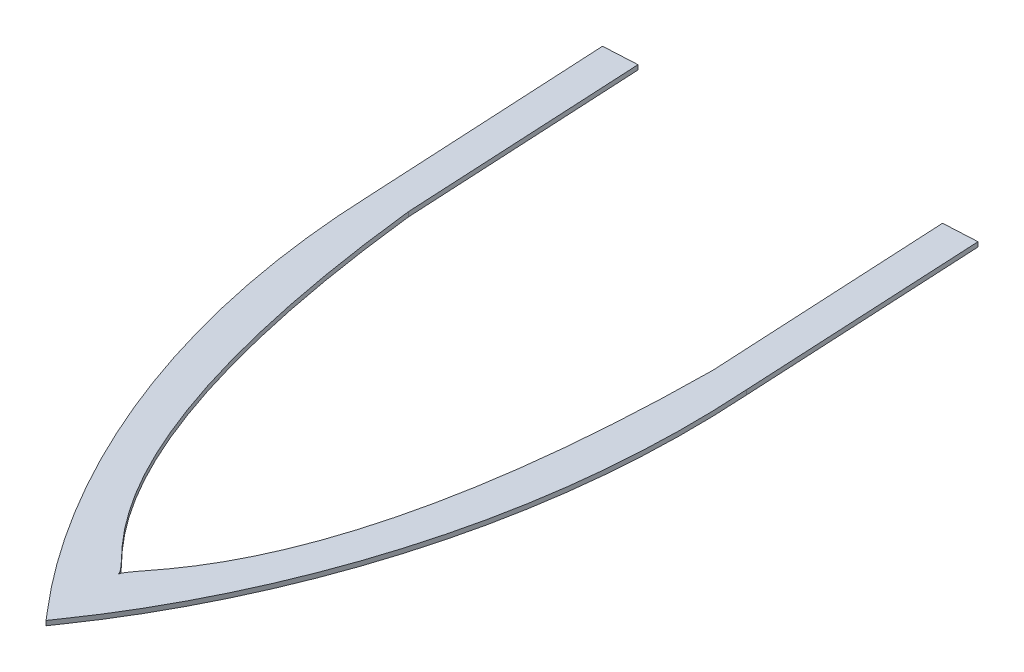
ISO-10303-21;
HEADER;
FILE_DESCRIPTION(('STEP AP214'),'2;1');
FILE_NAME('part.step','',(''),(''),'','','');
FILE_SCHEMA(('AUTOMOTIVE_DESIGN { 1 0 10303 214 1 1 1 1 }'));
ENDSEC;
DATA;
#1=APPLICATION_CONTEXT('core data for automotive mechanical design processes');
#2=APPLICATION_PROTOCOL_DEFINITION('international standard','automotive_design',2000,#1);
#3=PRODUCT_CONTEXT('',#1,'mechanical');
#4=PRODUCT('Part','Part','',(#3));
#5=PRODUCT_RELATED_PRODUCT_CATEGORY('part','',(#4));
#6=PRODUCT_DEFINITION_FORMATION('','',#4);
#7=PRODUCT_DEFINITION_CONTEXT('part definition',#1,'design');
#8=PRODUCT_DEFINITION('design','',#6,#7);
#9=PRODUCT_DEFINITION_SHAPE('','',#8);
#10=(LENGTH_UNIT() NAMED_UNIT(*) SI_UNIT(.MILLI.,.METRE.));
#11=(NAMED_UNIT(*) PLANE_ANGLE_UNIT() SI_UNIT($,.RADIAN.));
#12=(NAMED_UNIT(*) SI_UNIT($,.STERADIAN.) SOLID_ANGLE_UNIT());
#13=UNCERTAINTY_MEASURE_WITH_UNIT(LENGTH_MEASURE(1.E-05),#10,'distance_accuracy_value','');
#14=(GEOMETRIC_REPRESENTATION_CONTEXT(3) GLOBAL_UNCERTAINTY_ASSIGNED_CONTEXT((#13)) GLOBAL_UNIT_ASSIGNED_CONTEXT((#10,
#11,#12)) REPRESENTATION_CONTEXT('',''));
#15=CARTESIAN_POINT('',(0.,0.,0.));
#16=DIRECTION('',(0.,0.,1.));
#17=DIRECTION('',(1.,0.,0.));
#18=AXIS2_PLACEMENT_3D('',#15,#16,#17);
#19=CARTESIAN_POINT('',(-270.722371906054,4.,14.1879583138309));
#20=DIRECTION('',(0.998629534754574,0.,-0.0523359562429331));
#21=DIRECTION('',(-0.0523359562429331,0.,-0.998629534754575));
#22=AXIS2_PLACEMENT_3D('',#19,#20,#21);
#23=PLANE('',#22);
#24=DIRECTION('',(0.0523359562429331,0.,0.998629534754574));
#25=VECTOR('',#24,1.);
#26=CARTESIAN_POINT('',(-270.722371906054,0.,14.1879583138309));
#27=LINE('',#26,#25);
#28=CARTESIAN_POINT('',(-287.599492609348,0.,-307.846688721076));
#29=VERTEX_POINT('',#28);
#30=CARTESIAN_POINT('',(-276.509158993073,0.,-96.2305170763891));
#31=VERTEX_POINT('',#30);
#32=EDGE_CURVE('E146',#29,#31,#27,.T.);
#33=ORIENTED_EDGE('',*,*,#32,.T.);
#34=DIRECTION('',(0.,-1.,0.));
#35=VECTOR('',#34,1.);
#36=CARTESIAN_POINT('',(-276.509158993073,4.,-96.2305170763891));
#37=LINE('',#36,#35);
#38=CARTESIAN_POINT('',(-276.509158993073,4.,-96.2305170763891));
#39=VERTEX_POINT('',#38);
#40=EDGE_CURVE('E11',#39,#31,#37,.T.);
#41=ORIENTED_EDGE('',*,*,#40,.F.);
#42=DIRECTION('',(0.0523359562429331,0.,0.998629534754574));
#43=VECTOR('',#42,1.);
#44=CARTESIAN_POINT('',(-270.722371906054,4.,14.1879583138309));
#45=LINE('',#44,#43);
#46=CARTESIAN_POINT('',(-287.599492609348,4.,-307.846688721076));
#47=VERTEX_POINT('',#46);
#48=EDGE_CURVE('E190',#47,#39,#45,.T.);
#49=ORIENTED_EDGE('',*,*,#48,.F.);
#50=DIRECTION('',(0.,-1.,0.));
#51=VECTOR('',#50,1.);
#52=CARTESIAN_POINT('',(-287.599492609348,4.,-307.846688721076));
#53=LINE('',#52,#51);
#54=EDGE_CURVE('E51',#47,#29,#53,.T.);
#55=ORIENTED_EDGE('',*,*,#54,.T.);
#56=EDGE_LOOP('',(#33,#41,#49,#55));
#57=FACE_BOUND('',#56,.T.);
#58=ADVANCED_FACE('F35',(#57),#23,.F.);
#59=CARTESIAN_POINT('',(-276.509158993073,4.,-96.230517076389));
#60=CARTESIAN_POINT('',(-265.498754923844,4.,193.422418567869));
#61=CARTESIAN_POINT('',(-100.154473104291,4.,360.089981135763));
#62=CARTESIAN_POINT('',(-97.4552708592133,4.,365.359331922617));
#63=B_SPLINE_CURVE_WITH_KNOTS('',3,(#59,#60,#61,#62),.UNSPECIFIED.,.F.,.F.,(4,4),(0.,1.),.UNSPECIFIED.);
#64=DIRECTION('',(0.,-1.,0.));
#65=VECTOR('',#64,1.);
#66=SURFACE_OF_LINEAR_EXTRUSION('',#63,#65);
#67=CARTESIAN_POINT('',(-276.509158993073,0.,-96.230517076389));
#68=CARTESIAN_POINT('',(-265.498754923844,0.,193.422418567869));
#69=CARTESIAN_POINT('',(-100.154473104291,0.,360.089981135763));
#70=CARTESIAN_POINT('',(-97.4552708592133,0.,365.359331922617));
#71=B_SPLINE_CURVE_WITH_KNOTS('',3,(#67,#68,#69,#70),.UNSPECIFIED.,.F.,.F.,(4,4),(0.,1.),.UNSPECIFIED.);
#72=CARTESIAN_POINT('',(-97.4552708592133,0.,365.359331922617));
#73=VERTEX_POINT('',#72);
#74=EDGE_CURVE('E148',#31,#73,#71,.T.);
#75=ORIENTED_EDGE('',*,*,#74,.T.);
#76=DIRECTION('',(0.,-1.,0.));
#77=VECTOR('',#76,1.);
#78=CARTESIAN_POINT('',(-97.4552708592133,4.,365.359331922617));
#79=LINE('',#78,#77);
#80=CARTESIAN_POINT('',(-97.4552708592133,4.,365.359331922617));
#81=VERTEX_POINT('',#80);
#82=EDGE_CURVE('E43',#81,#73,#79,.T.);
#83=ORIENTED_EDGE('',*,*,#82,.F.);
#84=EDGE_CURVE('E95',#39,#81,#63,.T.);
#85=ORIENTED_EDGE('',*,*,#84,.F.);
#86=ORIENTED_EDGE('',*,*,#40,.T.);
#87=EDGE_LOOP('',(#75,#83,#85,#86));
#88=FACE_BOUND('',#87,.T.);
#89=ADVANCED_FACE('F209',(#88),#66,.F.);
#90=CARTESIAN_POINT('',(33.0780470708618,4.,-112.224730274756));
#91=CARTESIAN_POINT('',(51.9752892534009,4.,177.020747413313));
#92=CARTESIAN_POINT('',(-95.3134508933976,4.,359.83987925874));
#93=CARTESIAN_POINT('',(-97.4552708592133,4.,365.359331922617));
#94=B_SPLINE_CURVE_WITH_KNOTS('',3,(#90,#91,#92,#93),.UNSPECIFIED.,.F.,.F.,(4,4),(0.,1.),.UNSPECIFIED.);
#95=DIRECTION('',(0.,-1.,0.));
#96=VECTOR('',#95,1.);
#97=SURFACE_OF_LINEAR_EXTRUSION('',#94,#96);
#98=CARTESIAN_POINT('',(33.0780470708618,0.,-112.224730274756));
#99=CARTESIAN_POINT('',(51.9752892534009,0.,177.020747413313));
#100=CARTESIAN_POINT('',(-95.3134508933976,0.,359.83987925874));
#101=CARTESIAN_POINT('',(-97.4552708592133,0.,365.359331922617));
#102=B_SPLINE_CURVE_WITH_KNOTS('',3,(#98,#99,#100,#101),.UNSPECIFIED.,.F.,.F.,(4,4),(0.,1.),.UNSPECIFIED.);
#103=CARTESIAN_POINT('',(33.078047070862,0.,-112.224730274756));
#104=VERTEX_POINT('',#103);
#105=EDGE_CURVE('E153',#104,#73,#102,.T.);
#106=ORIENTED_EDGE('',*,*,#105,.F.);
#107=DIRECTION('',(0.,-1.,0.));
#108=VECTOR('',#107,1.);
#109=CARTESIAN_POINT('',(33.078047070862,4.,-112.224730274756));
#110=LINE('',#109,#108);
#111=CARTESIAN_POINT('',(33.078047070862,4.,-112.224730274756));
#112=VERTEX_POINT('',#111);
#113=EDGE_CURVE('E202',#112,#104,#110,.T.);
#114=ORIENTED_EDGE('',*,*,#113,.F.);
#115=EDGE_CURVE('E208',#112,#81,#94,.T.);
#116=ORIENTED_EDGE('',*,*,#115,.T.);
#117=ORIENTED_EDGE('',*,*,#82,.T.);
#118=EDGE_LOOP('',(#106,#114,#116,#117));
#119=FACE_BOUND('',#118,.T.);
#120=ADVANCED_FACE('F206',(#119),#97,.T.);
#121=CARTESIAN_POINT('',(38.6920279270494,4.,-1.97013377182649));
#122=DIRECTION('',(0.99870617671342,0.,-0.0508524590798017));
#123=DIRECTION('',(-0.0508524590798017,0.,-0.99870617671342));
#124=AXIS2_PLACEMENT_3D('',#121,#122,#123);
#125=PLANE('',#124);
#126=DIRECTION('',(0.0508524590798017,0.,0.99870617671342));
#127=VECTOR('',#126,1.);
#128=CARTESIAN_POINT('',(38.6920279270494,0.,-1.97013377182649));
#129=LINE('',#128,#127);
#130=CARTESIAN_POINT('',(22.3020762682055,0.,-323.857142854999));
#131=VERTEX_POINT('',#130);
#132=EDGE_CURVE('E161',#131,#104,#129,.T.);
#133=ORIENTED_EDGE('',*,*,#132,.F.);
#134=DIRECTION('',(0.,-1.,0.));
#135=VECTOR('',#134,1.);
#136=CARTESIAN_POINT('',(22.3020762682055,4.,-323.857142854999));
#137=LINE('',#136,#135);
#138=CARTESIAN_POINT('',(22.3020762682055,4.,-323.857142854999));
#139=VERTEX_POINT('',#138);
#140=EDGE_CURVE('E200',#139,#131,#137,.T.);
#141=ORIENTED_EDGE('',*,*,#140,.F.);
#142=DIRECTION('',(0.0508524590798017,0.,0.99870617671342));
#143=VECTOR('',#142,1.);
#144=CARTESIAN_POINT('',(38.6920279270494,4.,-1.97013377182649));
#145=LINE('',#144,#143);
#146=EDGE_CURVE('E221',#139,#112,#145,.T.);
#147=ORIENTED_EDGE('',*,*,#146,.T.);
#148=ORIENTED_EDGE('',*,*,#113,.T.);
#149=EDGE_LOOP('',(#133,#141,#147,#148));
#150=FACE_BOUND('',#149,.T.);
#151=ADVANCED_FACE('F217',(#150),#125,.T.);
#152=CARTESIAN_POINT('',(-16.6275355664419,4.,-321.845921140351));
#153=DIRECTION('',(0.0515942218925896,0.,0.998668131196394));
#154=DIRECTION('',(0.998668131196394,0.,-0.0515942218925896));
#155=AXIS2_PLACEMENT_3D('',#152,#153,#154);
#156=PLANE('',#155);
#157=DIRECTION('',(-0.998668131196394,0.,0.0515942218925896));
#158=VECTOR('',#157,1.);
#159=CARTESIAN_POINT('',(-16.6275355664419,0.,-321.845921140351));
#160=LINE('',#159,#158);
#161=CARTESIAN_POINT('',(-6.9622272218468,0.,-322.345260257935));
#162=VERTEX_POINT('',#161);
#163=EDGE_CURVE('E167',#131,#162,#160,.T.);
#164=ORIENTED_EDGE('',*,*,#163,.T.);
#165=DIRECTION('',(0.,-1.,0.));
#166=VECTOR('',#165,1.);
#167=CARTESIAN_POINT('',(-6.9622272218468,4.,-322.345260257935));
#168=LINE('',#167,#166);
#169=CARTESIAN_POINT('',(-6.9622272218468,4.,-322.345260257935));
#170=VERTEX_POINT('',#169);
#171=EDGE_CURVE('E197',#170,#162,#168,.T.);
#172=ORIENTED_EDGE('',*,*,#171,.F.);
#173=DIRECTION('',(-0.998668131196394,0.,0.0515942218925896));
#174=VECTOR('',#173,1.);
#175=CARTESIAN_POINT('',(-16.6275355664419,4.,-321.845921140351));
#176=LINE('',#175,#174);
#177=EDGE_CURVE('E223',#139,#170,#176,.T.);
#178=ORIENTED_EDGE('',*,*,#177,.F.);
#179=ORIENTED_EDGE('',*,*,#140,.T.);
#180=EDGE_LOOP('',(#164,#172,#178,#179));
#181=FACE_BOUND('',#180,.T.);
#182=ADVANCED_FACE('F277',(#181),#156,.F.);
#183=CARTESIAN_POINT('',(9.66530834459519,4.,-0.499339117584474));
#184=DIRECTION('',(0.998668131196394,0.,-0.0515942218925897));
#185=DIRECTION('',(-0.0515942218925897,0.,-0.998668131196394));
#186=AXIS2_PLACEMENT_3D('',#183,#184,#185);
#187=PLANE('',#186);
#188=DIRECTION('',(0.0515942218925897,0.,0.998668131196394));
#189=VECTOR('',#188,1.);
#190=CARTESIAN_POINT('',(9.66530834459519,0.,-0.499339117584474));
#191=LINE('',#190,#189);
#192=CARTESIAN_POINT('',(3.89599175315783,0.,-112.171390895898));
#193=VERTEX_POINT('',#192);
#194=EDGE_CURVE('E169',#162,#193,#191,.T.);
#195=ORIENTED_EDGE('',*,*,#194,.T.);
#196=DIRECTION('',(0.,-1.,0.));
#197=VECTOR('',#196,1.);
#198=CARTESIAN_POINT('',(3.89599175315783,4.,-112.171390895898));
#199=LINE('',#198,#197);
#200=CARTESIAN_POINT('',(3.89599175315783,4.,-112.171390895898));
#201=VERTEX_POINT('',#200);
#202=EDGE_CURVE('E194',#201,#193,#199,.T.);
#203=ORIENTED_EDGE('',*,*,#202,.F.);
#204=DIRECTION('',(0.0515942218925897,0.,0.998668131196394));
#205=VECTOR('',#204,1.);
#206=CARTESIAN_POINT('',(9.66530834459519,4.,-0.499339117584474));
#207=LINE('',#206,#205);
#208=EDGE_CURVE('E269',#170,#201,#207,.T.);
#209=ORIENTED_EDGE('',*,*,#208,.F.);
#210=ORIENTED_EDGE('',*,*,#171,.T.);
#211=EDGE_LOOP('',(#195,#203,#209,#210));
#212=FACE_BOUND('',#211,.T.);
#213=ADVANCED_FACE('F263',(#212),#187,.F.);
#214=CARTESIAN_POINT('',(3.89599175315738,4.,-112.171390895899));
#215=CARTESIAN_POINT('',(0.792272957225135,4.,222.804502890156));
#216=CARTESIAN_POINT('',(-99.7753704817289,4.,283.213639778669));
#217=CARTESIAN_POINT('',(-100.871017471523,4.,299.243453810193));
#218=B_SPLINE_CURVE_WITH_KNOTS('',3,(#214,#215,#216,#217),.UNSPECIFIED.,.F.,.F.,(4,4),(0.,1.),.UNSPECIFIED.);
#219=DIRECTION('',(0.,-1.,0.));
#220=VECTOR('',#219,1.);
#221=SURFACE_OF_LINEAR_EXTRUSION('',#218,#220);
#222=CARTESIAN_POINT('',(3.89599175315738,0.,-112.171390895899));
#223=CARTESIAN_POINT('',(0.792272957225135,0.,222.804502890156));
#224=CARTESIAN_POINT('',(-99.7753704817289,0.,283.213639778669));
#225=CARTESIAN_POINT('',(-100.871017471523,0.,299.243453810193));
#226=B_SPLINE_CURVE_WITH_KNOTS('',3,(#222,#223,#224,#225),.UNSPECIFIED.,.F.,.F.,(4,4),(0.,1.),.UNSPECIFIED.);
#227=CARTESIAN_POINT('',(-100.871017471523,0.,299.243453810193));
#228=VERTEX_POINT('',#227);
#229=EDGE_CURVE('E171',#193,#228,#226,.T.);
#230=ORIENTED_EDGE('',*,*,#229,.T.);
#231=DIRECTION('',(0.,-1.,0.));
#232=VECTOR('',#231,1.);
#233=CARTESIAN_POINT('',(-100.871017471523,4.,299.243453810193));
#234=LINE('',#233,#232);
#235=CARTESIAN_POINT('',(-100.871017471523,4.,299.243453810193));
#236=VERTEX_POINT('',#235);
#237=EDGE_CURVE('E126',#236,#228,#234,.T.);
#238=ORIENTED_EDGE('',*,*,#237,.F.);
#239=EDGE_CURVE('E134',#201,#236,#218,.T.);
#240=ORIENTED_EDGE('',*,*,#239,.F.);
#241=ORIENTED_EDGE('',*,*,#202,.T.);
#242=EDGE_LOOP('',(#230,#238,#240,#241));
#243=FACE_BOUND('',#242,.T.);
#244=ADVANCED_FACE('F260',(#243),#221,.F.);
#245=CARTESIAN_POINT('',(-247.476970144291,4.,-99.184701956103));
#246=CARTESIAN_POINT('',(-209.87017103594,4.,233.687963111118));
#247=CARTESIAN_POINT('',(-103.612719847342,4.,283.411888875105));
#248=CARTESIAN_POINT('',(-100.871017471523,4.,299.243453810193));
#249=B_SPLINE_CURVE_WITH_KNOTS('',3,(#245,#246,#247,#248),.UNSPECIFIED.,.F.,.F.,(4,4),(0.,1.),.UNSPECIFIED.);
#250=DIRECTION('',(0.,-1.,0.));
#251=VECTOR('',#250,1.);
#252=SURFACE_OF_LINEAR_EXTRUSION('',#249,#251);
#253=CARTESIAN_POINT('',(-247.476970144291,0.,-99.184701956103));
#254=CARTESIAN_POINT('',(-209.87017103594,0.,233.687963111118));
#255=CARTESIAN_POINT('',(-103.612719847342,0.,283.411888875105));
#256=CARTESIAN_POINT('',(-100.871017471523,0.,299.243453810193));
#257=B_SPLINE_CURVE_WITH_KNOTS('',3,(#253,#254,#255,#256),.UNSPECIFIED.,.F.,.F.,(4,4),(0.,1.),.UNSPECIFIED.);
#258=CARTESIAN_POINT('',(-247.476970144291,0.,-99.184701956103));
#259=VERTEX_POINT('',#258);
#260=EDGE_CURVE('E122',#259,#228,#257,.T.);
#261=ORIENTED_EDGE('',*,*,#260,.F.);
#262=DIRECTION('',(0.,-1.,0.));
#263=VECTOR('',#262,1.);
#264=CARTESIAN_POINT('',(-247.476970144291,4.,-99.184701956103));
#265=LINE('',#264,#263);
#266=CARTESIAN_POINT('',(-247.476970144291,4.,-99.184701956103));
#267=VERTEX_POINT('',#266);
#268=EDGE_CURVE('E117',#267,#259,#265,.T.);
#269=ORIENTED_EDGE('',*,*,#268,.F.);
#270=EDGE_CURVE('E120',#267,#236,#249,.T.);
#271=ORIENTED_EDGE('',*,*,#270,.T.);
#272=ORIENTED_EDGE('',*,*,#237,.T.);
#273=EDGE_LOOP('',(#261,#269,#271,#272));
#274=FACE_BOUND('',#273,.T.);
#275=ADVANCED_FACE('F119',(#274),#252,.T.);
#276=CARTESIAN_POINT('',(-241.707653552854,4.,12.4873498222111));
#277=DIRECTION('',(0.998668131196394,0.,-0.0515942218925898));
#278=DIRECTION('',(-0.0515942218925898,0.,-0.998668131196394));
#279=AXIS2_PLACEMENT_3D('',#276,#277,#278);
#280=PLANE('',#279);
#281=DIRECTION('',(0.0515942218925898,0.,0.998668131196394));
#282=VECTOR('',#281,1.);
#283=CARTESIAN_POINT('',(-241.707653552854,0.,12.4873498222111));
#284=LINE('',#283,#282);
#285=CARTESIAN_POINT('',(-258.335189119296,0.,-309.35857131814));
#286=VERTEX_POINT('',#285);
#287=EDGE_CURVE('E182',#286,#259,#284,.T.);
#288=ORIENTED_EDGE('',*,*,#287,.F.);
#289=DIRECTION('',(0.,-1.,0.));
#290=VECTOR('',#289,1.);
#291=CARTESIAN_POINT('',(-258.335189119296,4.,-309.35857131814));
#292=LINE('',#291,#290);
#293=CARTESIAN_POINT('',(-258.335189119296,4.,-309.35857131814));
#294=VERTEX_POINT('',#293);
#295=EDGE_CURVE('E83',#294,#286,#292,.T.);
#296=ORIENTED_EDGE('',*,*,#295,.F.);
#297=DIRECTION('',(0.0515942218925898,0.,0.998668131196394));
#298=VECTOR('',#297,1.);
#299=CARTESIAN_POINT('',(-241.707653552854,4.,12.4873498222111));
#300=LINE('',#299,#298);
#301=EDGE_CURVE('E132',#294,#267,#300,.T.);
#302=ORIENTED_EDGE('',*,*,#301,.T.);
#303=ORIENTED_EDGE('',*,*,#268,.T.);
#304=EDGE_LOOP('',(#288,#296,#302,#303));
#305=FACE_BOUND('',#304,.T.);
#306=ADVANCED_FACE('F137',(#305),#280,.T.);
#307=CARTESIAN_POINT('',(-16.6275355664413,4.,-321.84592114035));
#308=DIRECTION('',(-0.0515942218925877,0.,-0.998668131196394));
#309=DIRECTION('',(-0.998668131196394,0.,0.0515942218925877));
#310=AXIS2_PLACEMENT_3D('',#307,#308,#309);
#311=PLANE('',#310);
#312=DIRECTION('',(0.998668131196394,0.,-0.0515942218925877));
#313=VECTOR('',#312,1.);
#314=CARTESIAN_POINT('',(-16.6275355664413,0.,-321.84592114035));
#315=LINE('',#314,#313);
#316=EDGE_CURVE('E187',#29,#286,#315,.T.);
#317=ORIENTED_EDGE('',*,*,#316,.F.);
#318=ORIENTED_EDGE('',*,*,#54,.F.);
#319=DIRECTION('',(0.998668131196394,0.,-0.0515942218925877));
#320=VECTOR('',#319,1.);
#321=CARTESIAN_POINT('',(-16.6275355664413,4.,-321.84592114035));
#322=LINE('',#321,#320);
#323=EDGE_CURVE('E138',#47,#294,#322,.T.);
#324=ORIENTED_EDGE('',*,*,#323,.T.);
#325=ORIENTED_EDGE('',*,*,#295,.T.);
#326=EDGE_LOOP('',(#317,#318,#324,#325));
#327=FACE_BOUND('',#326,.T.);
#328=ADVANCED_FACE('F247',(#327),#311,.T.);
#329=CARTESIAN_POINT('',(0.,4.,0.));
#330=DIRECTION('',(0.,1.,0.));
#331=DIRECTION('',(0.,0.,1.));
#332=AXIS2_PLACEMENT_3D('',#329,#330,#331);
#333=PLANE('',#332);
#334=ORIENTED_EDGE('',*,*,#48,.T.);
#335=ORIENTED_EDGE('',*,*,#84,.T.);
#336=ORIENTED_EDGE('',*,*,#115,.F.);
#337=ORIENTED_EDGE('',*,*,#146,.F.);
#338=ORIENTED_EDGE('',*,*,#177,.T.);
#339=ORIENTED_EDGE('',*,*,#208,.T.);
#340=ORIENTED_EDGE('',*,*,#239,.T.);
#341=ORIENTED_EDGE('',*,*,#270,.F.);
#342=ORIENTED_EDGE('',*,*,#301,.F.);
#343=ORIENTED_EDGE('',*,*,#323,.F.);
#344=EDGE_LOOP('',(#334,#335,#336,#337,#338,#339,#340,#341,#342,#343));
#345=FACE_BOUND('',#344,.T.);
#346=ADVANCED_FACE('F130',(#345),#333,.T.);
#347=CARTESIAN_POINT('',(0.,0.,0.));
#348=DIRECTION('',(0.,1.,0.));
#349=DIRECTION('',(0.,0.,1.));
#350=AXIS2_PLACEMENT_3D('',#347,#348,#349);
#351=PLANE('',#350);
#352=ORIENTED_EDGE('',*,*,#32,.F.);
#353=ORIENTED_EDGE('',*,*,#316,.T.);
#354=ORIENTED_EDGE('',*,*,#287,.T.);
#355=ORIENTED_EDGE('',*,*,#260,.T.);
#356=ORIENTED_EDGE('',*,*,#229,.F.);
#357=ORIENTED_EDGE('',*,*,#194,.F.);
#358=ORIENTED_EDGE('',*,*,#163,.F.);
#359=ORIENTED_EDGE('',*,*,#132,.T.);
#360=ORIENTED_EDGE('',*,*,#105,.T.);
#361=ORIENTED_EDGE('',*,*,#74,.F.);
#362=EDGE_LOOP('',(#352,#353,#354,#355,#356,#357,#358,#359,#360,#361));
#363=FACE_BOUND('',#362,.T.);
#364=ADVANCED_FACE('F212',(#363),#351,.F.);
#365=CLOSED_SHELL('',(#58,#89,#120,#151,#182,#213,#244,#275,#306,#328,#346,#364));
#366=MANIFOLD_SOLID_BREP('B2',#365);
#367=ADVANCED_BREP_SHAPE_REPRESENTATION('',(#18,#366),#14);
#368=SHAPE_DEFINITION_REPRESENTATION(#9,#367);
ENDSEC;
END-ISO-10303-21;
